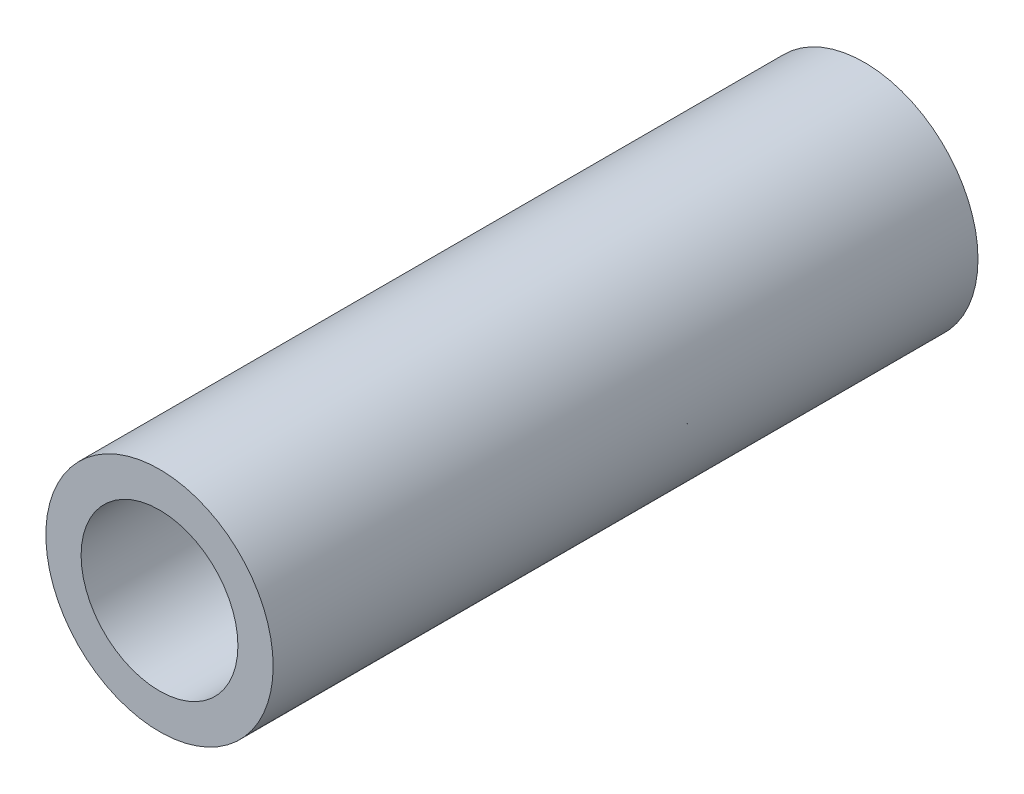
ISO-10303-21;
HEADER;
FILE_DESCRIPTION(('STEP AP214'),'2;1');
FILE_NAME('part.step','',(''),(''),'','','');
FILE_SCHEMA(('AUTOMOTIVE_DESIGN { 1 0 10303 214 1 1 1 1 }'));
ENDSEC;
DATA;
#1=APPLICATION_CONTEXT('core data for automotive mechanical design processes');
#2=APPLICATION_PROTOCOL_DEFINITION('international standard','automotive_design',2000,#1);
#3=PRODUCT_CONTEXT('',#1,'mechanical');
#4=PRODUCT('Part','Part','',(#3));
#5=PRODUCT_RELATED_PRODUCT_CATEGORY('part','',(#4));
#6=PRODUCT_DEFINITION_FORMATION('','',#4);
#7=PRODUCT_DEFINITION_CONTEXT('part definition',#1,'design');
#8=PRODUCT_DEFINITION('design','',#6,#7);
#9=PRODUCT_DEFINITION_SHAPE('','',#8);
#10=(LENGTH_UNIT() NAMED_UNIT(*) SI_UNIT(.MILLI.,.METRE.));
#11=(NAMED_UNIT(*) PLANE_ANGLE_UNIT() SI_UNIT($,.RADIAN.));
#12=(NAMED_UNIT(*) SI_UNIT($,.STERADIAN.) SOLID_ANGLE_UNIT());
#13=UNCERTAINTY_MEASURE_WITH_UNIT(LENGTH_MEASURE(1.E-05),#10,'distance_accuracy_value','');
#14=(GEOMETRIC_REPRESENTATION_CONTEXT(3) GLOBAL_UNCERTAINTY_ASSIGNED_CONTEXT((#13)) GLOBAL_UNIT_ASSIGNED_CONTEXT((#10,
#11,#12)) REPRESENTATION_CONTEXT('',''));
#15=CARTESIAN_POINT('',(0.,0.,0.));
#16=DIRECTION('',(0.,0.,1.));
#17=DIRECTION('',(1.,0.,0.));
#18=AXIS2_PLACEMENT_3D('',#15,#16,#17);
#19=CARTESIAN_POINT('',(0.,0.,40.));
#20=DIRECTION('',(0.,0.,-1.));
#21=DIRECTION('',(-1.,0.,0.));
#22=AXIS2_PLACEMENT_3D('',#19,#20,#21);
#23=CYLINDRICAL_SURFACE('',#22,4.45);
#24=CARTESIAN_POINT('',(0.,0.,40.));
#25=DIRECTION('',(0.,0.,1.));
#26=DIRECTION('',(1.,0.,0.));
#27=AXIS2_PLACEMENT_3D('',#24,#25,#26);
#28=CIRCLE('',#27,4.45);
#29=CARTESIAN_POINT('',(4.45,0.,40.));
#30=VERTEX_POINT('',#29);
#31=EDGE_CURVE('E48',#30,#30,#28,.T.);
#32=ORIENTED_EDGE('',*,*,#31,.T.);
#33=EDGE_LOOP('',(#32));
#34=FACE_BOUND('',#33,.T.);
#35=CARTESIAN_POINT('',(0.,0.,3.));
#36=DIRECTION('',(0.,0.,-1.));
#37=DIRECTION('',(-1.,0.,0.));
#38=AXIS2_PLACEMENT_3D('',#35,#36,#37);
#39=CIRCLE('',#38,4.45);
#40=CARTESIAN_POINT('',(-4.45,0.,3.));
#41=VERTEX_POINT('',#40);
#42=EDGE_CURVE('E52',#41,#41,#39,.T.);
#43=ORIENTED_EDGE('',*,*,#42,.T.);
#44=EDGE_LOOP('',(#43));
#45=FACE_BOUND('',#44,.T.);
#46=ADVANCED_FACE('F37',(#34,#45),#23,.F.);
#47=CARTESIAN_POINT('',(0.,0.,40.));
#48=DIRECTION('',(0.,0.,1.));
#49=DIRECTION('',(1.,0.,0.));
#50=AXIS2_PLACEMENT_3D('',#47,#48,#49);
#51=PLANE('',#50);
#52=CARTESIAN_POINT('',(0.,0.,40.));
#53=DIRECTION('',(0.,0.,1.));
#54=DIRECTION('',(1.,0.,0.));
#55=AXIS2_PLACEMENT_3D('',#52,#53,#54);
#56=CIRCLE('',#55,6.45);
#57=CARTESIAN_POINT('',(6.45,0.,40.));
#58=VERTEX_POINT('',#57);
#59=EDGE_CURVE('E11',#58,#58,#56,.T.);
#60=ORIENTED_EDGE('',*,*,#59,.T.);
#61=EDGE_LOOP('',(#60));
#62=FACE_BOUND('',#61,.T.);
#63=ORIENTED_EDGE('',*,*,#31,.F.);
#64=EDGE_LOOP('',(#63));
#65=FACE_BOUND('',#64,.T.);
#66=ADVANCED_FACE('F67',(#62,#65),#51,.T.);
#67=CARTESIAN_POINT('',(0.,0.,0.));
#68=DIRECTION('',(0.,0.,1.));
#69=DIRECTION('',(1.,0.,0.));
#70=AXIS2_PLACEMENT_3D('',#67,#68,#69);
#71=PLANE('',#70);
#72=CARTESIAN_POINT('',(0.,0.,0.));
#73=DIRECTION('',(0.,0.,1.));
#74=DIRECTION('',(1.,0.,0.));
#75=AXIS2_PLACEMENT_3D('',#72,#73,#74);
#76=CIRCLE('',#75,6.45);
#77=CARTESIAN_POINT('',(6.45,0.,0.));
#78=VERTEX_POINT('',#77);
#79=EDGE_CURVE('E41',#78,#78,#76,.T.);
#80=ORIENTED_EDGE('',*,*,#79,.F.);
#81=EDGE_LOOP('',(#80));
#82=FACE_BOUND('',#81,.T.);
#83=ADVANCED_FACE('F63',(#82),#71,.F.);
#84=CARTESIAN_POINT('',(0.,0.,40.));
#85=DIRECTION('',(0.,0.,-1.));
#86=DIRECTION('',(-1.,0.,0.));
#87=AXIS2_PLACEMENT_3D('',#84,#85,#86);
#88=CYLINDRICAL_SURFACE('',#87,6.45);
#89=ORIENTED_EDGE('',*,*,#59,.F.);
#90=EDGE_LOOP('',(#89));
#91=FACE_BOUND('',#90,.T.);
#92=ORIENTED_EDGE('',*,*,#79,.T.);
#93=EDGE_LOOP('',(#92));
#94=FACE_BOUND('',#93,.T.);
#95=ADVANCED_FACE('F39',(#91,#94),#88,.T.);
#96=CARTESIAN_POINT('',(0.,0.,3.));
#97=DIRECTION('',(0.,0.,-1.));
#98=DIRECTION('',(-1.,0.,0.));
#99=AXIS2_PLACEMENT_3D('',#96,#97,#98);
#100=PLANE('',#99);
#101=ORIENTED_EDGE('',*,*,#42,.F.);
#102=EDGE_LOOP('',(#101));
#103=FACE_BOUND('',#102,.T.);
#104=ADVANCED_FACE('F57',(#103),#100,.F.);
#105=CLOSED_SHELL('',(#46,#66,#83,#95,#104));
#106=MANIFOLD_SOLID_BREP('B2',#105);
#107=ADVANCED_BREP_SHAPE_REPRESENTATION('',(#18,#106),#14);
#108=SHAPE_DEFINITION_REPRESENTATION(#9,#107);
ENDSEC;
END-ISO-10303-21;
